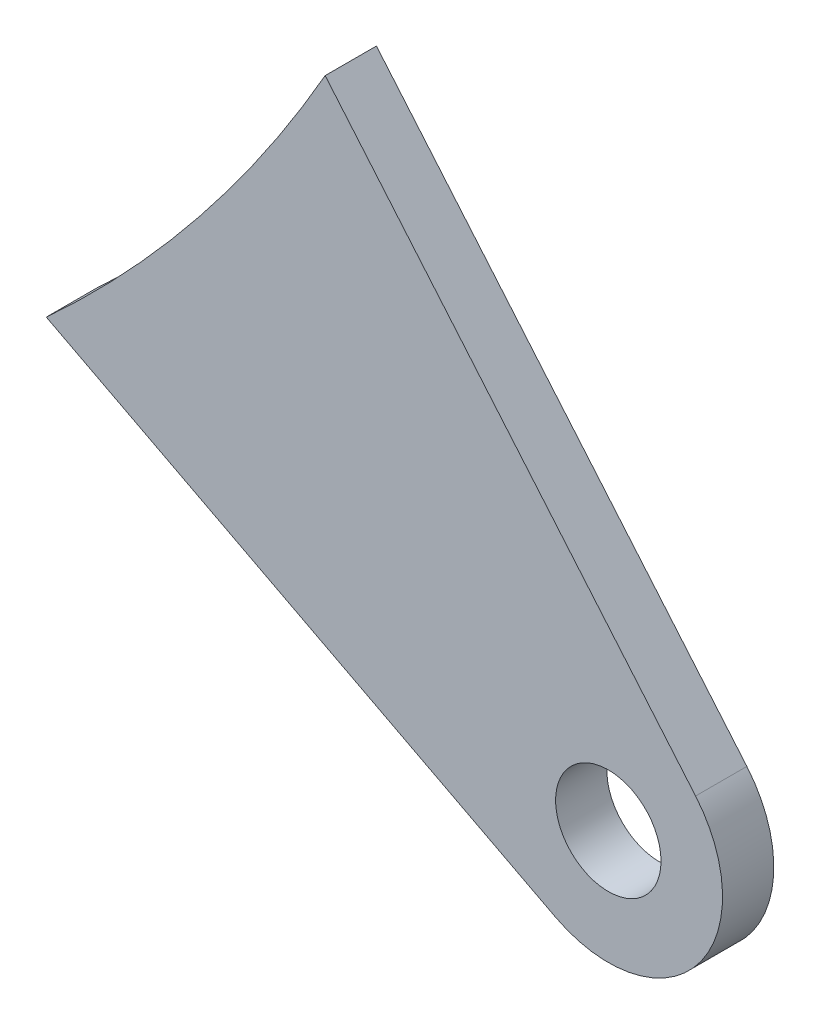
ISO-10303-21;
HEADER;
FILE_DESCRIPTION(('STEP AP214'),'2;1');
FILE_NAME('part.step','',(''),(''),'','','');
FILE_SCHEMA(('AUTOMOTIVE_DESIGN { 1 0 10303 214 1 1 1 1 }'));
ENDSEC;
DATA;
#1=APPLICATION_CONTEXT('core data for automotive mechanical design processes');
#2=APPLICATION_PROTOCOL_DEFINITION('international standard','automotive_design',2000,#1);
#3=PRODUCT_CONTEXT('',#1,'mechanical');
#4=PRODUCT('Part','Part','',(#3));
#5=PRODUCT_RELATED_PRODUCT_CATEGORY('part','',(#4));
#6=PRODUCT_DEFINITION_FORMATION('','',#4);
#7=PRODUCT_DEFINITION_CONTEXT('part definition',#1,'design');
#8=PRODUCT_DEFINITION('design','',#6,#7);
#9=PRODUCT_DEFINITION_SHAPE('','',#8);
#10=(LENGTH_UNIT() NAMED_UNIT(*) SI_UNIT(.MILLI.,.METRE.));
#11=(NAMED_UNIT(*) PLANE_ANGLE_UNIT() SI_UNIT($,.RADIAN.));
#12=(NAMED_UNIT(*) SI_UNIT($,.STERADIAN.) SOLID_ANGLE_UNIT());
#13=UNCERTAINTY_MEASURE_WITH_UNIT(LENGTH_MEASURE(1.E-05),#10,'distance_accuracy_value','');
#14=(GEOMETRIC_REPRESENTATION_CONTEXT(3) GLOBAL_UNCERTAINTY_ASSIGNED_CONTEXT((#13)) GLOBAL_UNIT_ASSIGNED_CONTEXT((#10,
#11,#12)) REPRESENTATION_CONTEXT('',''));
#15=CARTESIAN_POINT('',(0.,0.,0.));
#16=DIRECTION('',(0.,0.,1.));
#17=DIRECTION('',(1.,0.,0.));
#18=AXIS2_PLACEMENT_3D('',#15,#16,#17);
#19=CARTESIAN_POINT('',(-6.39445000019845,0.,3.175));
#20=DIRECTION('',(0.,0.,1.));
#21=DIRECTION('',(1.,0.,0.));
#22=AXIS2_PLACEMENT_3D('',#19,#20,#21);
#23=PLANE('',#22);
#24=CARTESIAN_POINT('',(-6.39445000019845,0.,3.175));
#25=DIRECTION('',(0.,0.,-1.));
#26=DIRECTION('',(1.,0.,0.));
#27=AXIS2_PLACEMENT_3D('',#24,#25,#26);
#28=CIRCLE('',#27,89.535);
#29=CARTESIAN_POINT('',(71.3178480731692,-44.4670097168232,3.175));
#30=VERTEX_POINT('',#29);
#31=CARTESIAN_POINT('',(54.0467956421246,-66.0558252556454,3.175));
#32=VERTEX_POINT('',#31);
#33=EDGE_CURVE('E98',#30,#32,#28,.T.);
#34=ORIENTED_EDGE('',*,*,#33,.T.);
#35=DIRECTION('',(0.88702383299734,-0.461723639956529,0.));
#36=VECTOR('',#35,1.);
#37=CARTESIAN_POINT('',(54.0467956421246,-66.0558252556454,3.175));
#38=LINE('',#37,#36);
#39=CARTESIAN_POINT('',(85.58936314351,-82.4747178924996,3.175));
#40=VERTEX_POINT('',#39);
#41=EDGE_CURVE('E93',#32,#40,#38,.T.);
#42=ORIENTED_EDGE('',*,*,#41,.T.);
#43=CARTESIAN_POINT('',(88.8555500001985,-76.2000000002597,3.175));
#44=DIRECTION('',(0.,0.,1.));
#45=DIRECTION('',(1.,0.,0.));
#46=AXIS2_PLACEMENT_3D('',#43,#44,#45);
#47=CIRCLE('',#46,7.07389999999998);
#48=CARTESIAN_POINT('',(94.2602581460341,-71.6360991393363,3.175));
#49=VERTEX_POINT('',#48);
#50=EDGE_CURVE('E96',#40,#49,#47,.T.);
#51=ORIENTED_EDGE('',*,*,#50,.T.);
#52=DIRECTION('',(-0.645174636469765,0.764035135616226,0.));
#53=VECTOR('',#52,1.);
#54=CARTESIAN_POINT('',(71.3178480731692,-44.4670097168232,3.175));
#55=LINE('',#54,#53);
#56=EDGE_CURVE('E63',#49,#30,#55,.T.);
#57=ORIENTED_EDGE('',*,*,#56,.T.);
#58=EDGE_LOOP('',(#34,#42,#51,#57));
#59=FACE_BOUND('',#58,.T.);
#60=CARTESIAN_POINT('',(88.8555500001985,-76.2000000002597,3.175));
#61=DIRECTION('',(0.,0.,1.));
#62=DIRECTION('',(1.,0.,0.));
#63=AXIS2_PLACEMENT_3D('',#60,#61,#62);
#64=CIRCLE('',#63,3.2639);
#65=CARTESIAN_POINT('',(92.1194500001985,-76.2000000002597,3.175));
#66=VERTEX_POINT('',#65);
#67=EDGE_CURVE('E118',#66,#66,#64,.T.);
#68=ORIENTED_EDGE('',*,*,#67,.F.);
#69=EDGE_LOOP('',(#68));
#70=FACE_BOUND('',#69,.T.);
#71=ADVANCED_FACE('F45',(#59,#70),#23,.T.);
#72=CARTESIAN_POINT('',(-6.39445000019845,0.,0.));
#73=DIRECTION('',(0.,0.,1.));
#74=DIRECTION('',(1.,0.,0.));
#75=AXIS2_PLACEMENT_3D('',#72,#73,#74);
#76=PLANE('',#75);
#77=CARTESIAN_POINT('',(-6.39445000019845,0.,0.));
#78=DIRECTION('',(0.,0.,-1.));
#79=DIRECTION('',(1.,0.,0.));
#80=AXIS2_PLACEMENT_3D('',#77,#78,#79);
#81=CIRCLE('',#80,89.535);
#82=CARTESIAN_POINT('',(71.3178480731692,-44.4670097168232,0.));
#83=VERTEX_POINT('',#82);
#84=CARTESIAN_POINT('',(54.0467956421246,-66.0558252556454,0.));
#85=VERTEX_POINT('',#84);
#86=EDGE_CURVE('E114',#83,#85,#81,.T.);
#87=ORIENTED_EDGE('',*,*,#86,.F.);
#88=DIRECTION('',(-0.645174636469765,0.764035135616226,0.));
#89=VECTOR('',#88,1.);
#90=CARTESIAN_POINT('',(71.3178480731692,-44.4670097168232,0.));
#91=LINE('',#90,#89);
#92=CARTESIAN_POINT('',(94.2602581460341,-71.6360991393363,0.));
#93=VERTEX_POINT('',#92);
#94=EDGE_CURVE('E86',#93,#83,#91,.T.);
#95=ORIENTED_EDGE('',*,*,#94,.F.);
#96=CARTESIAN_POINT('',(88.8555500001985,-76.2000000002597,0.));
#97=DIRECTION('',(0.,0.,1.));
#98=DIRECTION('',(1.,0.,0.));
#99=AXIS2_PLACEMENT_3D('',#96,#97,#98);
#100=CIRCLE('',#99,7.07389999999998);
#101=CARTESIAN_POINT('',(85.58936314351,-82.4747178924996,0.));
#102=VERTEX_POINT('',#101);
#103=EDGE_CURVE('E80',#102,#93,#100,.T.);
#104=ORIENTED_EDGE('',*,*,#103,.F.);
#105=DIRECTION('',(0.88702383299734,-0.461723639956529,0.));
#106=VECTOR('',#105,1.);
#107=CARTESIAN_POINT('',(54.0467956421246,-66.0558252556454,0.));
#108=LINE('',#107,#106);
#109=EDGE_CURVE('E103',#85,#102,#108,.T.);
#110=ORIENTED_EDGE('',*,*,#109,.F.);
#111=EDGE_LOOP('',(#87,#95,#104,#110));
#112=FACE_BOUND('',#111,.T.);
#113=CARTESIAN_POINT('',(88.8555500001985,-76.2000000002597,0.));
#114=DIRECTION('',(0.,0.,1.));
#115=DIRECTION('',(1.,0.,0.));
#116=AXIS2_PLACEMENT_3D('',#113,#114,#115);
#117=CIRCLE('',#116,3.2639);
#118=CARTESIAN_POINT('',(92.1194500001985,-76.2000000002597,0.));
#119=VERTEX_POINT('',#118);
#120=EDGE_CURVE('E136',#119,#119,#117,.T.);
#121=ORIENTED_EDGE('',*,*,#120,.T.);
#122=EDGE_LOOP('',(#121));
#123=FACE_BOUND('',#122,.T.);
#124=ADVANCED_FACE('F131',(#112,#123),#76,.F.);
#125=CARTESIAN_POINT('',(-6.39445000019845,0.,3.175));
#126=DIRECTION('',(0.,0.,-1.));
#127=DIRECTION('',(-1.,0.,0.));
#128=AXIS2_PLACEMENT_3D('',#125,#126,#127);
#129=CYLINDRICAL_SURFACE('',#128,89.535);
#130=ORIENTED_EDGE('',*,*,#86,.T.);
#131=DIRECTION('',(0.,0.,-1.));
#132=VECTOR('',#131,1.);
#133=CARTESIAN_POINT('',(54.0467956421246,-66.0558252556454,3.175));
#134=LINE('',#133,#132);
#135=EDGE_CURVE('E11',#32,#85,#134,.T.);
#136=ORIENTED_EDGE('',*,*,#135,.F.);
#137=ORIENTED_EDGE('',*,*,#33,.F.);
#138=DIRECTION('',(0.,0.,-1.));
#139=VECTOR('',#138,1.);
#140=CARTESIAN_POINT('',(71.3178480731692,-44.4670097168232,3.175));
#141=LINE('',#140,#139);
#142=EDGE_CURVE('E110',#30,#83,#141,.T.);
#143=ORIENTED_EDGE('',*,*,#142,.T.);
#144=EDGE_LOOP('',(#130,#136,#137,#143));
#145=FACE_BOUND('',#144,.T.);
#146=ADVANCED_FACE('F47',(#145),#129,.F.);
#147=CARTESIAN_POINT('',(54.0467956421246,-66.0558252556454,3.175));
#148=DIRECTION('',(0.461723639956529,0.88702383299734,0.));
#149=DIRECTION('',(-0.88702383299734,0.461723639956529,0.));
#150=AXIS2_PLACEMENT_3D('',#147,#148,#149);
#151=PLANE('',#150);
#152=ORIENTED_EDGE('',*,*,#109,.T.);
#153=DIRECTION('',(0.,0.,-1.));
#154=VECTOR('',#153,1.);
#155=CARTESIAN_POINT('',(85.58936314351,-82.4747178924996,3.175));
#156=LINE('',#155,#154);
#157=EDGE_CURVE('E55',#40,#102,#156,.T.);
#158=ORIENTED_EDGE('',*,*,#157,.F.);
#159=ORIENTED_EDGE('',*,*,#41,.F.);
#160=ORIENTED_EDGE('',*,*,#135,.T.);
#161=EDGE_LOOP('',(#152,#158,#159,#160));
#162=FACE_BOUND('',#161,.T.);
#163=ADVANCED_FACE('F102',(#162),#151,.F.);
#164=CARTESIAN_POINT('',(88.8555500001985,-76.2000000002597,3.175));
#165=DIRECTION('',(0.,0.,-1.));
#166=DIRECTION('',(-1.,0.,0.));
#167=AXIS2_PLACEMENT_3D('',#164,#165,#166);
#168=CYLINDRICAL_SURFACE('',#167,7.07389999999998);
#169=ORIENTED_EDGE('',*,*,#103,.T.);
#170=DIRECTION('',(0.,0.,-1.));
#171=VECTOR('',#170,1.);
#172=CARTESIAN_POINT('',(94.2602581460341,-71.6360991393363,3.175));
#173=LINE('',#172,#171);
#174=EDGE_CURVE('E105',#49,#93,#173,.T.);
#175=ORIENTED_EDGE('',*,*,#174,.F.);
#176=ORIENTED_EDGE('',*,*,#50,.F.);
#177=ORIENTED_EDGE('',*,*,#157,.T.);
#178=EDGE_LOOP('',(#169,#175,#176,#177));
#179=FACE_BOUND('',#178,.T.);
#180=ADVANCED_FACE('F106',(#179),#168,.T.);
#181=CARTESIAN_POINT('',(71.3178480731692,-44.4670097168232,3.175));
#182=DIRECTION('',(-0.764035135616227,-0.645174636469766,0.));
#183=DIRECTION('',(0.645174636469766,-0.764035135616227,0.));
#184=AXIS2_PLACEMENT_3D('',#181,#182,#183);
#185=PLANE('',#184);
#186=ORIENTED_EDGE('',*,*,#94,.T.);
#187=ORIENTED_EDGE('',*,*,#142,.F.);
#188=ORIENTED_EDGE('',*,*,#56,.F.);
#189=ORIENTED_EDGE('',*,*,#174,.T.);
#190=EDGE_LOOP('',(#186,#187,#188,#189));
#191=FACE_BOUND('',#190,.T.);
#192=ADVANCED_FACE('F128',(#191),#185,.F.);
#193=CARTESIAN_POINT('',(88.8555500001985,-76.2000000002597,3.175));
#194=DIRECTION('',(0.,0.,-1.));
#195=DIRECTION('',(-1.,0.,0.));
#196=AXIS2_PLACEMENT_3D('',#193,#194,#195);
#197=CYLINDRICAL_SURFACE('',#196,3.2639);
#198=ORIENTED_EDGE('',*,*,#67,.T.);
#199=EDGE_LOOP('',(#198));
#200=FACE_BOUND('',#199,.T.);
#201=ORIENTED_EDGE('',*,*,#120,.F.);
#202=EDGE_LOOP('',(#201));
#203=FACE_BOUND('',#202,.T.);
#204=ADVANCED_FACE('F144',(#200,#203),#197,.F.);
#205=CLOSED_SHELL('',(#71,#124,#146,#163,#180,#192,#204));
#206=MANIFOLD_SOLID_BREP('B2',#205);
#207=ADVANCED_BREP_SHAPE_REPRESENTATION('',(#18,#206),#14);
#208=SHAPE_DEFINITION_REPRESENTATION(#9,#207);
ENDSEC;
END-ISO-10303-21;
